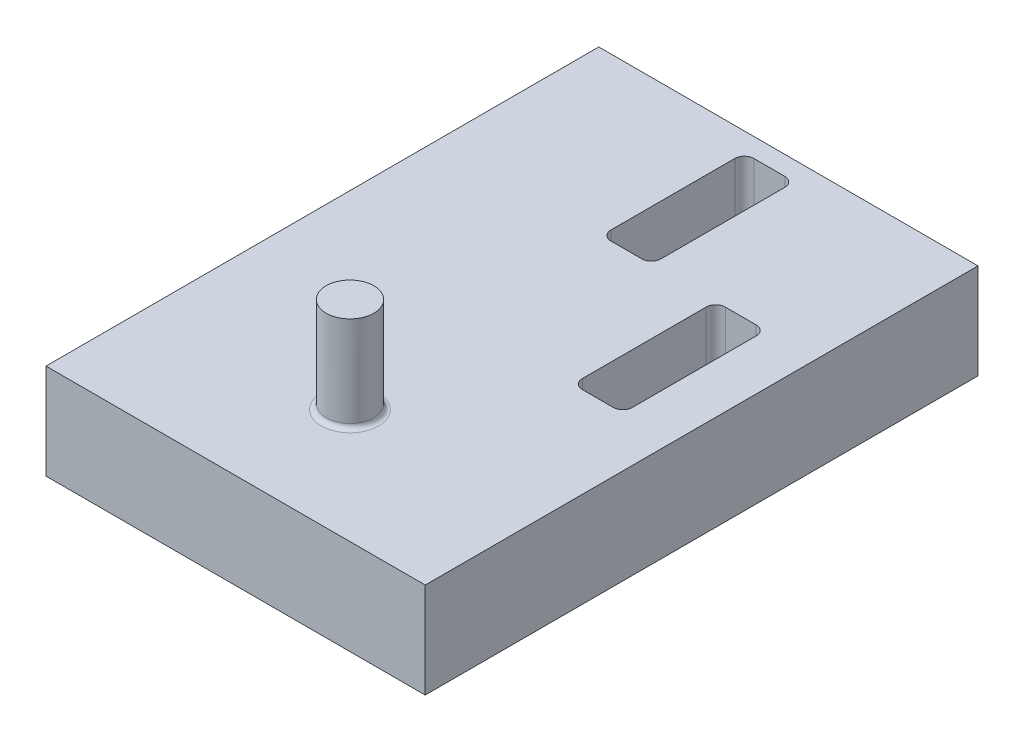
ISO-10303-21;
HEADER;
FILE_DESCRIPTION(('STEP AP214'),'2;1');
FILE_NAME('part.step','',(''),(''),'','','');
FILE_SCHEMA(('AUTOMOTIVE_DESIGN { 1 0 10303 214 1 1 1 1 }'));
ENDSEC;
DATA;
#1=APPLICATION_CONTEXT('core data for automotive mechanical design processes');
#2=APPLICATION_PROTOCOL_DEFINITION('international standard','automotive_design',2000,#1);
#3=PRODUCT_CONTEXT('',#1,'mechanical');
#4=PRODUCT('Part','Part','',(#3));
#5=PRODUCT_RELATED_PRODUCT_CATEGORY('part','',(#4));
#6=PRODUCT_DEFINITION_FORMATION('','',#4);
#7=PRODUCT_DEFINITION_CONTEXT('part definition',#1,'design');
#8=PRODUCT_DEFINITION('design','',#6,#7);
#9=PRODUCT_DEFINITION_SHAPE('','',#8);
#10=(LENGTH_UNIT() NAMED_UNIT(*) SI_UNIT(.MILLI.,.METRE.));
#11=(NAMED_UNIT(*) PLANE_ANGLE_UNIT() SI_UNIT($,.RADIAN.));
#12=(NAMED_UNIT(*) SI_UNIT($,.STERADIAN.) SOLID_ANGLE_UNIT());
#13=UNCERTAINTY_MEASURE_WITH_UNIT(LENGTH_MEASURE(1.E-05),#10,'distance_accuracy_value','');
#14=(GEOMETRIC_REPRESENTATION_CONTEXT(3) GLOBAL_UNCERTAINTY_ASSIGNED_CONTEXT((#13)) GLOBAL_UNIT_ASSIGNED_CONTEXT((#10,
#11,#12)) REPRESENTATION_CONTEXT('',''));
#15=CARTESIAN_POINT('',(0.,0.,0.));
#16=DIRECTION('',(0.,0.,1.));
#17=DIRECTION('',(1.,0.,0.));
#18=AXIS2_PLACEMENT_3D('',#15,#16,#17);
#19=CARTESIAN_POINT('',(0.,10.,0.));
#20=DIRECTION('',(0.,-1.,0.));
#21=DIRECTION('',(0.,0.,-1.));
#22=AXIS2_PLACEMENT_3D('',#19,#20,#21);
#23=PLANE('',#22);
#24=CARTESIAN_POINT('',(0.,10.,-31.5));
#25=DIRECTION('',(0.,-1.,0.));
#26=DIRECTION('',(0.,0.,-1.));
#27=AXIS2_PLACEMENT_3D('',#24,#25,#26);
#28=CIRCLE('',#27,3.);
#29=CARTESIAN_POINT('',(0.,10.,-34.5));
#30=VERTEX_POINT('',#29);
#31=EDGE_CURVE('E11',#30,#30,#28,.T.);
#32=ORIENTED_EDGE('',*,*,#31,.T.);
#33=EDGE_LOOP('',(#32));
#34=FACE_BOUND('',#33,.T.);
#35=DIRECTION('',(-1.,0.,0.));
#36=VECTOR('',#35,1.);
#37=CARTESIAN_POINT('',(11.9999999999999,10.,-60.5));
#38=LINE('',#37,#36);
#39=CARTESIAN_POINT('',(13.6249999999999,10.,-60.5));
#40=VERTEX_POINT('',#39);
#41=CARTESIAN_POINT('',(10.375,10.,-60.5));
#42=VERTEX_POINT('',#41);
#43=EDGE_CURVE('E369',#40,#42,#38,.T.);
#44=ORIENTED_EDGE('',*,*,#43,.F.);
#45=CARTESIAN_POINT('',(13.6249999999999,10.,-59.5));
#46=DIRECTION('',(0.,-1.,0.));
#47=DIRECTION('',(0.,0.,-1.));
#48=AXIS2_PLACEMENT_3D('',#45,#46,#47);
#49=CIRCLE('',#48,1.);
#50=CARTESIAN_POINT('',(14.6249999999999,10.,-59.5));
#51=VERTEX_POINT('',#50);
#52=EDGE_CURVE('E277',#40,#51,#49,.T.);
#53=ORIENTED_EDGE('',*,*,#52,.T.);
#54=DIRECTION('',(0.,0.,-1.));
#55=VECTOR('',#54,1.);
#56=CARTESIAN_POINT('',(14.6249999999999,10.,-60.5));
#57=LINE('',#56,#55);
#58=CARTESIAN_POINT('',(14.6249999999999,10.,-46.5));
#59=VERTEX_POINT('',#58);
#60=EDGE_CURVE('E367',#59,#51,#57,.T.);
#61=ORIENTED_EDGE('',*,*,#60,.F.);
#62=CARTESIAN_POINT('',(13.625,10.,-46.5));
#63=DIRECTION('',(0.,-1.,0.));
#64=DIRECTION('',(0.,0.,-1.));
#65=AXIS2_PLACEMENT_3D('',#62,#63,#64);
#66=CIRCLE('',#65,1.);
#67=CARTESIAN_POINT('',(13.625,10.,-45.5));
#68=VERTEX_POINT('',#67);
#69=EDGE_CURVE('E270',#59,#68,#66,.T.);
#70=ORIENTED_EDGE('',*,*,#69,.T.);
#71=DIRECTION('',(1.,0.,0.));
#72=VECTOR('',#71,1.);
#73=CARTESIAN_POINT('',(12.,10.,-45.5));
#74=LINE('',#73,#72);
#75=CARTESIAN_POINT('',(10.375,10.,-45.5));
#76=VERTEX_POINT('',#75);
#77=EDGE_CURVE('E385',#76,#68,#74,.T.);
#78=ORIENTED_EDGE('',*,*,#77,.F.);
#79=CARTESIAN_POINT('',(10.375,10.,-46.5));
#80=DIRECTION('',(0.,-1.,0.));
#81=DIRECTION('',(0.,0.,-1.));
#82=AXIS2_PLACEMENT_3D('',#79,#80,#81);
#83=CIRCLE('',#82,1.);
#84=CARTESIAN_POINT('',(9.37499999999995,10.,-46.5));
#85=VERTEX_POINT('',#84);
#86=EDGE_CURVE('E266',#76,#85,#83,.T.);
#87=ORIENTED_EDGE('',*,*,#86,.T.);
#88=DIRECTION('',(0.,0.,1.));
#89=VECTOR('',#88,1.);
#90=CARTESIAN_POINT('',(9.37499999999995,10.,-60.5));
#91=LINE('',#90,#89);
#92=CARTESIAN_POINT('',(9.37499999999995,10.,-59.5));
#93=VERTEX_POINT('',#92);
#94=EDGE_CURVE('E376',#93,#85,#91,.T.);
#95=ORIENTED_EDGE('',*,*,#94,.F.);
#96=CARTESIAN_POINT('',(10.375,10.,-59.5));
#97=DIRECTION('',(0.,-1.,0.));
#98=DIRECTION('',(0.,0.,-1.));
#99=AXIS2_PLACEMENT_3D('',#96,#97,#98);
#100=CIRCLE('',#99,1.);
#101=EDGE_CURVE('E57',#93,#42,#100,.T.);
#102=ORIENTED_EDGE('',*,*,#101,.T.);
#103=EDGE_LOOP('',(#44,#53,#61,#70,#78,#87,#95,#102));
#104=FACE_BOUND('',#103,.T.);
#105=DIRECTION('',(-1.,0.,0.));
#106=VECTOR('',#105,1.);
#107=CARTESIAN_POINT('',(0.,10.,-75.5));
#108=LINE('',#107,#106);
#109=CARTESIAN_POINT('',(1.62500000000019,10.,-75.5000000000001));
#110=VERTEX_POINT('',#109);
#111=CARTESIAN_POINT('',(-1.62500000000002,10.,-75.5));
#112=VERTEX_POINT('',#111);
#113=EDGE_CURVE('E197',#110,#112,#108,.T.);
#114=ORIENTED_EDGE('',*,*,#113,.F.);
#115=CARTESIAN_POINT('',(1.6250000000002,10.,-74.5000000000001));
#116=DIRECTION('',(0.,-1.,0.));
#117=DIRECTION('',(0.,0.,-1.));
#118=AXIS2_PLACEMENT_3D('',#115,#116,#117);
#119=CIRCLE('',#118,1.);
#120=CARTESIAN_POINT('',(2.62500000000014,10.,-74.5000000000001));
#121=VERTEX_POINT('',#120);
#122=EDGE_CURVE('E242',#110,#121,#119,.T.);
#123=ORIENTED_EDGE('',*,*,#122,.T.);
#124=DIRECTION('',(0.,0.,-1.));
#125=VECTOR('',#124,1.);
#126=CARTESIAN_POINT('',(2.62500000000012,10.,-60.5));
#127=LINE('',#126,#125);
#128=CARTESIAN_POINT('',(2.62500000000012,10.,-61.5));
#129=VERTEX_POINT('',#128);
#130=EDGE_CURVE('E399',#129,#121,#127,.T.);
#131=ORIENTED_EDGE('',*,*,#130,.F.);
#132=CARTESIAN_POINT('',(1.62500000000018,10.,-61.5));
#133=DIRECTION('',(0.,-1.,0.));
#134=DIRECTION('',(0.,0.,-1.));
#135=AXIS2_PLACEMENT_3D('',#132,#133,#134);
#136=CIRCLE('',#135,1.);
#137=CARTESIAN_POINT('',(1.62500000000018,10.,-60.5));
#138=VERTEX_POINT('',#137);
#139=EDGE_CURVE('E238',#129,#138,#136,.T.);
#140=ORIENTED_EDGE('',*,*,#139,.T.);
#141=DIRECTION('',(-1.,0.,0.));
#142=VECTOR('',#141,1.);
#143=CARTESIAN_POINT('',(0.,10.,-60.5));
#144=LINE('',#143,#142);
#145=CARTESIAN_POINT('',(-1.62500000000001,10.,-60.5));
#146=VERTEX_POINT('',#145);
#147=EDGE_CURVE('E414',#138,#146,#144,.T.);
#148=ORIENTED_EDGE('',*,*,#147,.T.);
#149=CARTESIAN_POINT('',(-1.62500000000001,10.,-61.5));
#150=DIRECTION('',(0.,-1.,0.));
#151=DIRECTION('',(0.,0.,-1.));
#152=AXIS2_PLACEMENT_3D('',#149,#150,#151);
#153=CIRCLE('',#152,1.);
#154=CARTESIAN_POINT('',(-2.62500000000006,10.,-61.5));
#155=VERTEX_POINT('',#154);
#156=EDGE_CURVE('E219',#146,#155,#153,.T.);
#157=ORIENTED_EDGE('',*,*,#156,.T.);
#158=DIRECTION('',(0.,0.,1.));
#159=VECTOR('',#158,1.);
#160=CARTESIAN_POINT('',(-2.62500000000006,10.,-75.5));
#161=LINE('',#160,#159);
#162=CARTESIAN_POINT('',(-2.62500000000006,10.,-74.5));
#163=VERTEX_POINT('',#162);
#164=EDGE_CURVE('E411',#163,#155,#161,.T.);
#165=ORIENTED_EDGE('',*,*,#164,.F.);
#166=CARTESIAN_POINT('',(-1.62500000000001,10.,-74.5));
#167=DIRECTION('',(0.,-1.,0.));
#168=DIRECTION('',(0.,0.,-1.));
#169=AXIS2_PLACEMENT_3D('',#166,#167,#168);
#170=CIRCLE('',#169,1.);
#171=EDGE_CURVE('E223',#163,#112,#170,.T.);
#172=ORIENTED_EDGE('',*,*,#171,.T.);
#173=EDGE_LOOP('',(#114,#123,#131,#140,#148,#157,#165,#172));
#174=FACE_BOUND('',#173,.T.);
#175=DIRECTION('',(0.,0.,1.));
#176=VECTOR('',#175,1.);
#177=CARTESIAN_POINT('',(-19.8937990848772,10.,-77.5));
#178=LINE('',#177,#176);
#179=CARTESIAN_POINT('',(-19.8937990848772,10.,-77.5));
#180=VERTEX_POINT('',#179);
#181=CARTESIAN_POINT('',(-19.8937990848772,10.,-19.5000000000026));
#182=VERTEX_POINT('',#181);
#183=EDGE_CURVE('E205',#180,#182,#178,.T.);
#184=ORIENTED_EDGE('',*,*,#183,.T.);
#185=DIRECTION('',(-1.,0.,0.));
#186=VECTOR('',#185,1.);
#187=CARTESIAN_POINT('',(-19.8937990848772,10.,-19.5000000000026));
#188=LINE('',#187,#186);
#189=CARTESIAN_POINT('',(19.8937990848773,10.,-19.5000000000026));
#190=VERTEX_POINT('',#189);
#191=EDGE_CURVE('E174',#190,#182,#188,.T.);
#192=ORIENTED_EDGE('',*,*,#191,.F.);
#193=DIRECTION('',(0.,0.,1.));
#194=VECTOR('',#193,1.);
#195=CARTESIAN_POINT('',(19.8937990848774,10.,-77.5));
#196=LINE('',#195,#194);
#197=CARTESIAN_POINT('',(19.8937990848774,10.,-77.5));
#198=VERTEX_POINT('',#197);
#199=EDGE_CURVE('E396',#198,#190,#196,.T.);
#200=ORIENTED_EDGE('',*,*,#199,.F.);
#201=DIRECTION('',(1.,0.,0.));
#202=VECTOR('',#201,1.);
#203=CARTESIAN_POINT('',(-19.8937990848772,10.,-77.5));
#204=LINE('',#203,#202);
#205=EDGE_CURVE('E194',#180,#198,#204,.T.);
#206=ORIENTED_EDGE('',*,*,#205,.F.);
#207=EDGE_LOOP('',(#184,#192,#200,#206));
#208=FACE_BOUND('',#207,.T.);
#209=ADVANCED_FACE('F34',(#34,#104,#174,#208),#23,.F.);
#210=CARTESIAN_POINT('',(0.,0.,0.));
#211=DIRECTION('',(0.,-1.,0.));
#212=DIRECTION('',(0.,0.,-1.));
#213=AXIS2_PLACEMENT_3D('',#210,#211,#212);
#214=PLANE('',#213);
#215=DIRECTION('',(-1.,0.,0.));
#216=VECTOR('',#215,1.);
#217=CARTESIAN_POINT('',(-19.8937990848772,0.,-19.5000000000026));
#218=LINE('',#217,#216);
#219=CARTESIAN_POINT('',(19.8937990848773,0.,-19.5000000000026));
#220=VERTEX_POINT('',#219);
#221=CARTESIAN_POINT('',(-19.8937990848772,0.,-19.5000000000026));
#222=VERTEX_POINT('',#221);
#223=EDGE_CURVE('E49',#220,#222,#218,.T.);
#224=ORIENTED_EDGE('',*,*,#223,.T.);
#225=DIRECTION('',(0.,0.,1.));
#226=VECTOR('',#225,1.);
#227=CARTESIAN_POINT('',(-19.8937990848772,0.,-77.5));
#228=LINE('',#227,#226);
#229=CARTESIAN_POINT('',(-19.8937990848772,0.,-77.5));
#230=VERTEX_POINT('',#229);
#231=EDGE_CURVE('E187',#230,#222,#228,.T.);
#232=ORIENTED_EDGE('',*,*,#231,.F.);
#233=DIRECTION('',(1.,0.,0.));
#234=VECTOR('',#233,1.);
#235=CARTESIAN_POINT('',(-19.8937990848772,0.,-77.5));
#236=LINE('',#235,#234);
#237=CARTESIAN_POINT('',(19.8937990848774,0.,-77.5));
#238=VERTEX_POINT('',#237);
#239=EDGE_CURVE('E408',#230,#238,#236,.T.);
#240=ORIENTED_EDGE('',*,*,#239,.T.);
#241=DIRECTION('',(0.,0.,1.));
#242=VECTOR('',#241,1.);
#243=CARTESIAN_POINT('',(19.8937990848774,0.,-77.5));
#244=LINE('',#243,#242);
#245=EDGE_CURVE('E190',#238,#220,#244,.T.);
#246=ORIENTED_EDGE('',*,*,#245,.T.);
#247=EDGE_LOOP('',(#224,#232,#240,#246));
#248=FACE_BOUND('',#247,.T.);
#249=DIRECTION('',(0.,0.,1.));
#250=VECTOR('',#249,1.);
#251=CARTESIAN_POINT('',(2.6250000000002,0.,-75.5));
#252=LINE('',#251,#250);
#253=CARTESIAN_POINT('',(2.6250000000002,0.,-74.5000000000001));
#254=VERTEX_POINT('',#253);
#255=CARTESIAN_POINT('',(2.62500000000018,0.,-61.5));
#256=VERTEX_POINT('',#255);
#257=EDGE_CURVE('E400',#254,#256,#252,.T.);
#258=ORIENTED_EDGE('',*,*,#257,.F.);
#259=CARTESIAN_POINT('',(1.6250000000002,0.,-74.5000000000001));
#260=DIRECTION('',(0.,-1.,0.));
#261=DIRECTION('',(0.,0.,-1.));
#262=AXIS2_PLACEMENT_3D('',#259,#260,#261);
#263=CIRCLE('',#262,1.);
#264=CARTESIAN_POINT('',(1.62500000000019,0.,-75.5000000000001));
#265=VERTEX_POINT('',#264);
#266=EDGE_CURVE('E240',#254,#265,#263,.F.);
#267=ORIENTED_EDGE('',*,*,#266,.T.);
#268=DIRECTION('',(-1.,0.,0.));
#269=VECTOR('',#268,1.);
#270=CARTESIAN_POINT('',(0.,0.,-75.5));
#271=LINE('',#270,#269);
#272=CARTESIAN_POINT('',(-1.62500000000002,0.,-75.5));
#273=VERTEX_POINT('',#272);
#274=EDGE_CURVE('E418',#265,#273,#271,.T.);
#275=ORIENTED_EDGE('',*,*,#274,.T.);
#276=CARTESIAN_POINT('',(-1.62500000000001,0.,-74.5));
#277=DIRECTION('',(0.,-1.,0.));
#278=DIRECTION('',(0.,0.,-1.));
#279=AXIS2_PLACEMENT_3D('',#276,#277,#278);
#280=CIRCLE('',#279,1.);
#281=CARTESIAN_POINT('',(-2.62500000000001,0.,-74.5));
#282=VERTEX_POINT('',#281);
#283=EDGE_CURVE('E221',#273,#282,#280,.F.);
#284=ORIENTED_EDGE('',*,*,#283,.T.);
#285=DIRECTION('',(0.,0.,-1.));
#286=VECTOR('',#285,1.);
#287=CARTESIAN_POINT('',(-2.62500000000001,0.,-60.5));
#288=LINE('',#287,#286);
#289=CARTESIAN_POINT('',(-2.62500000000001,0.,-61.5));
#290=VERTEX_POINT('',#289);
#291=EDGE_CURVE('E199',#290,#282,#288,.T.);
#292=ORIENTED_EDGE('',*,*,#291,.F.);
#293=CARTESIAN_POINT('',(-1.62500000000001,0.,-61.5));
#294=DIRECTION('',(0.,-1.,0.));
#295=DIRECTION('',(0.,0.,-1.));
#296=AXIS2_PLACEMENT_3D('',#293,#294,#295);
#297=CIRCLE('',#296,1.);
#298=CARTESIAN_POINT('',(-1.62500000000001,0.,-60.5));
#299=VERTEX_POINT('',#298);
#300=EDGE_CURVE('E216',#290,#299,#297,.F.);
#301=ORIENTED_EDGE('',*,*,#300,.T.);
#302=DIRECTION('',(-1.,0.,0.));
#303=VECTOR('',#302,1.);
#304=CARTESIAN_POINT('',(0.,0.,-60.5));
#305=LINE('',#304,#303);
#306=CARTESIAN_POINT('',(1.62500000000018,0.,-60.5));
#307=VERTEX_POINT('',#306);
#308=EDGE_CURVE('E195',#307,#299,#305,.T.);
#309=ORIENTED_EDGE('',*,*,#308,.F.);
#310=CARTESIAN_POINT('',(1.62500000000018,0.,-61.5));
#311=DIRECTION('',(0.,-1.,0.));
#312=DIRECTION('',(0.,0.,-1.));
#313=AXIS2_PLACEMENT_3D('',#310,#311,#312);
#314=CIRCLE('',#313,1.);
#315=EDGE_CURVE('E236',#307,#256,#314,.F.);
#316=ORIENTED_EDGE('',*,*,#315,.T.);
#317=EDGE_LOOP('',(#258,#267,#275,#284,#292,#301,#309,#316));
#318=FACE_BOUND('',#317,.T.);
#319=DIRECTION('',(1.,0.,0.));
#320=VECTOR('',#319,1.);
#321=CARTESIAN_POINT('',(12.,0.,-45.5));
#322=LINE('',#321,#320);
#323=CARTESIAN_POINT('',(10.375,0.,-45.5));
#324=VERTEX_POINT('',#323);
#325=CARTESIAN_POINT('',(13.625,0.,-45.5));
#326=VERTEX_POINT('',#325);
#327=EDGE_CURVE('E378',#324,#326,#322,.T.);
#328=ORIENTED_EDGE('',*,*,#327,.T.);
#329=CARTESIAN_POINT('',(13.625,0.,-46.5));
#330=DIRECTION('',(0.,-1.,0.));
#331=DIRECTION('',(0.,0.,-1.));
#332=AXIS2_PLACEMENT_3D('',#329,#330,#331);
#333=CIRCLE('',#332,1.);
#334=CARTESIAN_POINT('',(14.625,0.,-46.5));
#335=VERTEX_POINT('',#334);
#336=EDGE_CURVE('E268',#326,#335,#333,.F.);
#337=ORIENTED_EDGE('',*,*,#336,.T.);
#338=DIRECTION('',(0.,0.,-1.));
#339=VECTOR('',#338,1.);
#340=CARTESIAN_POINT('',(14.6249999999999,0.,-58.));
#341=LINE('',#340,#339);
#342=CARTESIAN_POINT('',(14.6249999999999,0.,-59.5));
#343=VERTEX_POINT('',#342);
#344=EDGE_CURVE('E374',#335,#343,#341,.T.);
#345=ORIENTED_EDGE('',*,*,#344,.T.);
#346=CARTESIAN_POINT('',(13.6249999999999,0.,-59.5));
#347=DIRECTION('',(0.,-1.,0.));
#348=DIRECTION('',(0.,0.,-1.));
#349=AXIS2_PLACEMENT_3D('',#346,#347,#348);
#350=CIRCLE('',#349,1.);
#351=CARTESIAN_POINT('',(13.6249999999999,0.,-60.5));
#352=VERTEX_POINT('',#351);
#353=EDGE_CURVE('E275',#343,#352,#350,.F.);
#354=ORIENTED_EDGE('',*,*,#353,.T.);
#355=DIRECTION('',(-1.,0.,0.));
#356=VECTOR('',#355,1.);
#357=CARTESIAN_POINT('',(11.9999999999999,0.,-60.5));
#358=LINE('',#357,#356);
#359=CARTESIAN_POINT('',(10.375,0.,-60.5));
#360=VERTEX_POINT('',#359);
#361=EDGE_CURVE('E388',#352,#360,#358,.T.);
#362=ORIENTED_EDGE('',*,*,#361,.T.);
#363=CARTESIAN_POINT('',(10.375,0.,-59.5));
#364=DIRECTION('',(0.,-1.,0.));
#365=DIRECTION('',(0.,0.,-1.));
#366=AXIS2_PLACEMENT_3D('',#363,#364,#365);
#367=CIRCLE('',#366,1.);
#368=CARTESIAN_POINT('',(9.37500000000001,0.,-59.5));
#369=VERTEX_POINT('',#368);
#370=EDGE_CURVE('E272',#360,#369,#367,.F.);
#371=ORIENTED_EDGE('',*,*,#370,.T.);
#372=DIRECTION('',(0.,0.,1.));
#373=VECTOR('',#372,1.);
#374=CARTESIAN_POINT('',(9.37500000000001,0.,-45.5));
#375=LINE('',#374,#373);
#376=CARTESIAN_POINT('',(9.37500000000001,0.,-46.5));
#377=VERTEX_POINT('',#376);
#378=EDGE_CURVE('E391',#369,#377,#375,.T.);
#379=ORIENTED_EDGE('',*,*,#378,.T.);
#380=CARTESIAN_POINT('',(10.375,0.,-46.5));
#381=DIRECTION('',(0.,-1.,0.));
#382=DIRECTION('',(0.,0.,-1.));
#383=AXIS2_PLACEMENT_3D('',#380,#381,#382);
#384=CIRCLE('',#383,1.);
#385=EDGE_CURVE('E264',#377,#324,#384,.F.);
#386=ORIENTED_EDGE('',*,*,#385,.T.);
#387=EDGE_LOOP('',(#328,#337,#345,#354,#362,#371,#379,#386));
#388=FACE_BOUND('',#387,.T.);
#389=ADVANCED_FACE('F185',(#248,#318,#388),#214,.T.);
#390=CARTESIAN_POINT('',(-19.8937990848772,10.,-77.5));
#391=DIRECTION('',(0.,0.,-1.));
#392=DIRECTION('',(-1.,0.,0.));
#393=AXIS2_PLACEMENT_3D('',#390,#391,#392);
#394=PLANE('',#393);
#395=ORIENTED_EDGE('',*,*,#239,.F.);
#396=DIRECTION('',(0.,-1.,0.));
#397=VECTOR('',#396,1.);
#398=CARTESIAN_POINT('',(-19.8937990848772,10.,-77.5));
#399=LINE('',#398,#397);
#400=EDGE_CURVE('E193',#180,#230,#399,.T.);
#401=ORIENTED_EDGE('',*,*,#400,.F.);
#402=ORIENTED_EDGE('',*,*,#205,.T.);
#403=DIRECTION('',(0.,-1.,0.));
#404=VECTOR('',#403,1.);
#405=CARTESIAN_POINT('',(19.8937990848774,10.,-77.5));
#406=LINE('',#405,#404);
#407=EDGE_CURVE('E403',#198,#238,#406,.T.);
#408=ORIENTED_EDGE('',*,*,#407,.T.);
#409=EDGE_LOOP('',(#395,#401,#402,#408));
#410=FACE_BOUND('',#409,.T.);
#411=ADVANCED_FACE('F301',(#410),#394,.T.);
#412=CARTESIAN_POINT('',(-19.8937990848772,10.,-77.5));
#413=DIRECTION('',(1.,0.,0.));
#414=DIRECTION('',(0.,0.,-1.));
#415=AXIS2_PLACEMENT_3D('',#412,#413,#414);
#416=PLANE('',#415);
#417=ORIENTED_EDGE('',*,*,#231,.T.);
#418=DIRECTION('',(0.,1.,0.));
#419=VECTOR('',#418,1.);
#420=CARTESIAN_POINT('',(-19.8937990848772,0.,-19.5000000000026));
#421=LINE('',#420,#419);
#422=EDGE_CURVE('E171',#222,#182,#421,.T.);
#423=ORIENTED_EDGE('',*,*,#422,.T.);
#424=ORIENTED_EDGE('',*,*,#183,.F.);
#425=ORIENTED_EDGE('',*,*,#400,.T.);
#426=EDGE_LOOP('',(#417,#423,#424,#425));
#427=FACE_BOUND('',#426,.T.);
#428=ADVANCED_FACE('F192',(#427),#416,.F.);
#429=CARTESIAN_POINT('',(0.,10.,-60.5));
#430=DIRECTION('',(0.,0.,1.));
#431=DIRECTION('',(1.,0.,0.));
#432=AXIS2_PLACEMENT_3D('',#429,#430,#431);
#433=PLANE('',#432);
#434=ORIENTED_EDGE('',*,*,#147,.F.);
#435=DIRECTION('',(0.,-1.,0.));
#436=VECTOR('',#435,1.);
#437=CARTESIAN_POINT('',(1.62500000000018,0.,-60.5));
#438=LINE('',#437,#436);
#439=EDGE_CURVE('E226',#138,#307,#438,.T.);
#440=ORIENTED_EDGE('',*,*,#439,.T.);
#441=ORIENTED_EDGE('',*,*,#308,.T.);
#442=DIRECTION('',(0.,-1.,0.));
#443=VECTOR('',#442,1.);
#444=CARTESIAN_POINT('',(-1.62500000000001,10.,-60.5));
#445=LINE('',#444,#443);
#446=EDGE_CURVE('E210',#299,#146,#445,.F.);
#447=ORIENTED_EDGE('',*,*,#446,.T.);
#448=EDGE_LOOP('',(#434,#440,#441,#447));
#449=FACE_BOUND('',#448,.T.);
#450=ADVANCED_FACE('F309',(#449),#433,.F.);
#451=CARTESIAN_POINT('',(-2.62500000000001,10.,-60.5));
#452=DIRECTION('',(-1.,0.,0.));
#453=DIRECTION('',(0.,0.,1.));
#454=AXIS2_PLACEMENT_3D('',#451,#452,#453);
#455=PLANE('',#454);
#456=ORIENTED_EDGE('',*,*,#164,.T.);
#457=DIRECTION('',(0.,-1.,0.));
#458=VECTOR('',#457,1.);
#459=CARTESIAN_POINT('',(-2.62500000000001,0.,-61.5));
#460=LINE('',#459,#458);
#461=EDGE_CURVE('E207',#155,#290,#460,.T.);
#462=ORIENTED_EDGE('',*,*,#461,.T.);
#463=ORIENTED_EDGE('',*,*,#291,.T.);
#464=DIRECTION('',(0.,-1.,0.));
#465=VECTOR('',#464,1.);
#466=CARTESIAN_POINT('',(-2.62500000000001,10.,-74.5));
#467=LINE('',#466,#465);
#468=EDGE_CURVE('E204',#282,#163,#467,.F.);
#469=ORIENTED_EDGE('',*,*,#468,.T.);
#470=EDGE_LOOP('',(#456,#462,#463,#469));
#471=FACE_BOUND('',#470,.T.);
#472=ADVANCED_FACE('F312',(#471),#455,.F.);
#473=CARTESIAN_POINT('',(0.,10.,-75.5));
#474=DIRECTION('',(0.,0.,1.));
#475=DIRECTION('',(1.,0.,0.));
#476=AXIS2_PLACEMENT_3D('',#473,#474,#475);
#477=PLANE('',#476);
#478=ORIENTED_EDGE('',*,*,#274,.F.);
#479=DIRECTION('',(0.,-1.,0.));
#480=VECTOR('',#479,1.);
#481=CARTESIAN_POINT('',(1.62500000000019,10.,-75.5000000000001));
#482=LINE('',#481,#480);
#483=EDGE_CURVE('E234',#265,#110,#482,.F.);
#484=ORIENTED_EDGE('',*,*,#483,.T.);
#485=ORIENTED_EDGE('',*,*,#113,.T.);
#486=DIRECTION('',(0.,-1.,0.));
#487=VECTOR('',#486,1.);
#488=CARTESIAN_POINT('',(-1.62500000000002,10.,-75.5));
#489=LINE('',#488,#487);
#490=EDGE_CURVE('E213',#112,#273,#489,.T.);
#491=ORIENTED_EDGE('',*,*,#490,.T.);
#492=EDGE_LOOP('',(#478,#484,#485,#491));
#493=FACE_BOUND('',#492,.T.);
#494=ADVANCED_FACE('F316',(#493),#477,.T.);
#495=CARTESIAN_POINT('',(-1.62500000000001,10.,-61.5));
#496=DIRECTION('',(0.,1.,0.));
#497=DIRECTION('',(0.,0.,1.));
#498=AXIS2_PLACEMENT_3D('',#495,#496,#497);
#499=CYLINDRICAL_SURFACE('',#498,1.);
#500=ORIENTED_EDGE('',*,*,#156,.F.);
#501=ORIENTED_EDGE('',*,*,#446,.F.);
#502=ORIENTED_EDGE('',*,*,#300,.F.);
#503=ORIENTED_EDGE('',*,*,#461,.F.);
#504=EDGE_LOOP('',(#500,#501,#502,#503));
#505=FACE_BOUND('',#504,.T.);
#506=ADVANCED_FACE('F320',(#505),#499,.F.);
#507=CARTESIAN_POINT('',(-1.62500000000001,10.,-74.5));
#508=DIRECTION('',(0.,-1.,0.));
#509=DIRECTION('',(0.,0.,-1.));
#510=AXIS2_PLACEMENT_3D('',#507,#508,#509);
#511=CYLINDRICAL_SURFACE('',#510,1.);
#512=ORIENTED_EDGE('',*,*,#171,.F.);
#513=ORIENTED_EDGE('',*,*,#468,.F.);
#514=ORIENTED_EDGE('',*,*,#283,.F.);
#515=ORIENTED_EDGE('',*,*,#490,.F.);
#516=EDGE_LOOP('',(#512,#513,#514,#515));
#517=FACE_BOUND('',#516,.T.);
#518=ADVANCED_FACE('F327',(#517),#511,.F.);
#519=CARTESIAN_POINT('',(2.6250000000002,10.,-75.5));
#520=DIRECTION('',(1.,0.,0.));
#521=DIRECTION('',(0.,0.,-1.));
#522=AXIS2_PLACEMENT_3D('',#519,#520,#521);
#523=PLANE('',#522);
#524=ORIENTED_EDGE('',*,*,#257,.T.);
#525=DIRECTION('',(0.,-1.,0.));
#526=VECTOR('',#525,1.);
#527=CARTESIAN_POINT('',(2.62500000000018,10.,-61.5));
#528=LINE('',#527,#526);
#529=EDGE_CURVE('E232',#256,#129,#528,.F.);
#530=ORIENTED_EDGE('',*,*,#529,.T.);
#531=ORIENTED_EDGE('',*,*,#130,.T.);
#532=DIRECTION('',(0.,-1.,0.));
#533=VECTOR('',#532,1.);
#534=CARTESIAN_POINT('',(2.6250000000002,10.,-74.5000000000001));
#535=LINE('',#534,#533);
#536=EDGE_CURVE('E229',#121,#254,#535,.T.);
#537=ORIENTED_EDGE('',*,*,#536,.T.);
#538=EDGE_LOOP('',(#524,#530,#531,#537));
#539=FACE_BOUND('',#538,.T.);
#540=ADVANCED_FACE('F331',(#539),#523,.F.);
#541=CARTESIAN_POINT('',(19.8937990848774,10.,-77.5));
#542=DIRECTION('',(1.,0.,0.));
#543=DIRECTION('',(0.,0.,-1.));
#544=AXIS2_PLACEMENT_3D('',#541,#542,#543);
#545=PLANE('',#544);
#546=DIRECTION('',(0.,1.,0.));
#547=VECTOR('',#546,1.);
#548=CARTESIAN_POINT('',(19.8937990848773,0.,-19.5000000000026));
#549=LINE('',#548,#547);
#550=EDGE_CURVE('E180',#220,#190,#549,.T.);
#551=ORIENTED_EDGE('',*,*,#550,.F.);
#552=ORIENTED_EDGE('',*,*,#245,.F.);
#553=ORIENTED_EDGE('',*,*,#407,.F.);
#554=ORIENTED_EDGE('',*,*,#199,.T.);
#555=EDGE_LOOP('',(#551,#552,#553,#554));
#556=FACE_BOUND('',#555,.T.);
#557=ADVANCED_FACE('F304',(#556),#545,.T.);
#558=CARTESIAN_POINT('',(1.62500000000018,10.,-61.5));
#559=DIRECTION('',(0.,1.,0.));
#560=DIRECTION('',(0.,0.,1.));
#561=AXIS2_PLACEMENT_3D('',#558,#559,#560);
#562=CYLINDRICAL_SURFACE('',#561,1.);
#563=ORIENTED_EDGE('',*,*,#139,.F.);
#564=ORIENTED_EDGE('',*,*,#529,.F.);
#565=ORIENTED_EDGE('',*,*,#315,.F.);
#566=ORIENTED_EDGE('',*,*,#439,.F.);
#567=EDGE_LOOP('',(#563,#564,#565,#566));
#568=FACE_BOUND('',#567,.T.);
#569=ADVANCED_FACE('F333',(#568),#562,.F.);
#570=CARTESIAN_POINT('',(1.6250000000002,10.,-74.5000000000001));
#571=DIRECTION('',(0.,-1.,0.));
#572=DIRECTION('',(0.,0.,-1.));
#573=AXIS2_PLACEMENT_3D('',#570,#571,#572);
#574=CYLINDRICAL_SURFACE('',#573,1.);
#575=ORIENTED_EDGE('',*,*,#122,.F.);
#576=ORIENTED_EDGE('',*,*,#483,.F.);
#577=ORIENTED_EDGE('',*,*,#266,.F.);
#578=ORIENTED_EDGE('',*,*,#536,.F.);
#579=EDGE_LOOP('',(#575,#576,#577,#578));
#580=FACE_BOUND('',#579,.T.);
#581=ADVANCED_FACE('F336',(#580),#574,.F.);
#582=CARTESIAN_POINT('',(11.9999999999999,10.,-60.5));
#583=DIRECTION('',(0.,0.,1.));
#584=DIRECTION('',(1.,0.,0.));
#585=AXIS2_PLACEMENT_3D('',#582,#583,#584);
#586=PLANE('',#585);
#587=ORIENTED_EDGE('',*,*,#43,.T.);
#588=DIRECTION('',(0.,-1.,0.));
#589=VECTOR('',#588,1.);
#590=CARTESIAN_POINT('',(10.375,0.,-60.5));
#591=LINE('',#590,#589);
#592=EDGE_CURVE('E261',#42,#360,#591,.T.);
#593=ORIENTED_EDGE('',*,*,#592,.T.);
#594=ORIENTED_EDGE('',*,*,#361,.F.);
#595=DIRECTION('',(0.,-1.,0.));
#596=VECTOR('',#595,1.);
#597=CARTESIAN_POINT('',(13.6249999999999,10.,-60.5));
#598=LINE('',#597,#596);
#599=EDGE_CURVE('E259',#352,#40,#598,.F.);
#600=ORIENTED_EDGE('',*,*,#599,.T.);
#601=EDGE_LOOP('',(#587,#593,#594,#600));
#602=FACE_BOUND('',#601,.T.);
#603=ADVANCED_FACE('F340',(#602),#586,.T.);
#604=CARTESIAN_POINT('',(9.37500000000001,10.,-45.5));
#605=DIRECTION('',(1.,0.,0.));
#606=DIRECTION('',(0.,0.,-1.));
#607=AXIS2_PLACEMENT_3D('',#604,#605,#606);
#608=PLANE('',#607);
#609=ORIENTED_EDGE('',*,*,#94,.T.);
#610=DIRECTION('',(0.,-1.,0.));
#611=VECTOR('',#610,1.);
#612=CARTESIAN_POINT('',(9.37500000000001,0.,-46.5));
#613=LINE('',#612,#611);
#614=EDGE_CURVE('E246',#85,#377,#613,.T.);
#615=ORIENTED_EDGE('',*,*,#614,.T.);
#616=ORIENTED_EDGE('',*,*,#378,.F.);
#617=DIRECTION('',(0.,-1.,0.));
#618=VECTOR('',#617,1.);
#619=CARTESIAN_POINT('',(9.37500000000001,10.,-59.5));
#620=LINE('',#619,#618);
#621=EDGE_CURVE('E244',#369,#93,#620,.F.);
#622=ORIENTED_EDGE('',*,*,#621,.T.);
#623=EDGE_LOOP('',(#609,#615,#616,#622));
#624=FACE_BOUND('',#623,.T.);
#625=ADVANCED_FACE('F453',(#624),#608,.T.);
#626=CARTESIAN_POINT('',(12.,10.,-45.5));
#627=DIRECTION('',(0.,0.,-1.));
#628=DIRECTION('',(-1.,0.,0.));
#629=AXIS2_PLACEMENT_3D('',#626,#627,#628);
#630=PLANE('',#629);
#631=ORIENTED_EDGE('',*,*,#327,.F.);
#632=DIRECTION('',(0.,-1.,0.));
#633=VECTOR('',#632,1.);
#634=CARTESIAN_POINT('',(10.375,10.,-45.5));
#635=LINE('',#634,#633);
#636=EDGE_CURVE('E252',#324,#76,#635,.F.);
#637=ORIENTED_EDGE('',*,*,#636,.T.);
#638=ORIENTED_EDGE('',*,*,#77,.T.);
#639=DIRECTION('',(0.,-1.,0.));
#640=VECTOR('',#639,1.);
#641=CARTESIAN_POINT('',(13.625,0.,-45.5));
#642=LINE('',#641,#640);
#643=EDGE_CURVE('E249',#68,#326,#642,.T.);
#644=ORIENTED_EDGE('',*,*,#643,.T.);
#645=EDGE_LOOP('',(#631,#637,#638,#644));
#646=FACE_BOUND('',#645,.T.);
#647=ADVANCED_FACE('F457',(#646),#630,.T.);
#648=CARTESIAN_POINT('',(14.6249999999999,10.,-58.));
#649=DIRECTION('',(-1.,0.,0.));
#650=DIRECTION('',(0.,0.,1.));
#651=AXIS2_PLACEMENT_3D('',#648,#649,#650);
#652=PLANE('',#651);
#653=ORIENTED_EDGE('',*,*,#344,.F.);
#654=DIRECTION('',(0.,-1.,0.));
#655=VECTOR('',#654,1.);
#656=CARTESIAN_POINT('',(14.625,10.,-46.5));
#657=LINE('',#656,#655);
#658=EDGE_CURVE('E257',#335,#59,#657,.F.);
#659=ORIENTED_EDGE('',*,*,#658,.T.);
#660=ORIENTED_EDGE('',*,*,#60,.T.);
#661=DIRECTION('',(0.,-1.,0.));
#662=VECTOR('',#661,1.);
#663=CARTESIAN_POINT('',(14.6249999999999,0.,-59.5));
#664=LINE('',#663,#662);
#665=EDGE_CURVE('E254',#51,#343,#664,.T.);
#666=ORIENTED_EDGE('',*,*,#665,.T.);
#667=EDGE_LOOP('',(#653,#659,#660,#666));
#668=FACE_BOUND('',#667,.T.);
#669=ADVANCED_FACE('F346',(#668),#652,.T.);
#670=CARTESIAN_POINT('',(10.375,10.,-46.5));
#671=DIRECTION('',(0.,1.,0.));
#672=DIRECTION('',(0.,0.,1.));
#673=AXIS2_PLACEMENT_3D('',#670,#671,#672);
#674=CYLINDRICAL_SURFACE('',#673,1.);
#675=ORIENTED_EDGE('',*,*,#86,.F.);
#676=ORIENTED_EDGE('',*,*,#636,.F.);
#677=ORIENTED_EDGE('',*,*,#385,.F.);
#678=ORIENTED_EDGE('',*,*,#614,.F.);
#679=EDGE_LOOP('',(#675,#676,#677,#678));
#680=FACE_BOUND('',#679,.T.);
#681=ADVANCED_FACE('F342',(#680),#674,.F.);
#682=CARTESIAN_POINT('',(13.625,10.,-46.5));
#683=DIRECTION('',(0.,1.,0.));
#684=DIRECTION('',(0.,0.,1.));
#685=AXIS2_PLACEMENT_3D('',#682,#683,#684);
#686=CYLINDRICAL_SURFACE('',#685,1.);
#687=ORIENTED_EDGE('',*,*,#69,.F.);
#688=ORIENTED_EDGE('',*,*,#658,.F.);
#689=ORIENTED_EDGE('',*,*,#336,.F.);
#690=ORIENTED_EDGE('',*,*,#643,.F.);
#691=EDGE_LOOP('',(#687,#688,#689,#690));
#692=FACE_BOUND('',#691,.T.);
#693=ADVANCED_FACE('F345',(#692),#686,.F.);
#694=CARTESIAN_POINT('',(10.375,10.,-59.5));
#695=DIRECTION('',(0.,1.,0.));
#696=DIRECTION('',(0.,0.,1.));
#697=AXIS2_PLACEMENT_3D('',#694,#695,#696);
#698=CYLINDRICAL_SURFACE('',#697,1.);
#699=ORIENTED_EDGE('',*,*,#101,.F.);
#700=ORIENTED_EDGE('',*,*,#621,.F.);
#701=ORIENTED_EDGE('',*,*,#370,.F.);
#702=ORIENTED_EDGE('',*,*,#592,.F.);
#703=EDGE_LOOP('',(#699,#700,#701,#702));
#704=FACE_BOUND('',#703,.T.);
#705=ADVANCED_FACE('F350',(#704),#698,.F.);
#706=CARTESIAN_POINT('',(13.6249999999999,10.,-59.5));
#707=DIRECTION('',(0.,1.,0.));
#708=DIRECTION('',(0.,0.,1.));
#709=AXIS2_PLACEMENT_3D('',#706,#707,#708);
#710=CYLINDRICAL_SURFACE('',#709,1.);
#711=ORIENTED_EDGE('',*,*,#52,.F.);
#712=ORIENTED_EDGE('',*,*,#599,.F.);
#713=ORIENTED_EDGE('',*,*,#353,.F.);
#714=ORIENTED_EDGE('',*,*,#665,.F.);
#715=EDGE_LOOP('',(#711,#712,#713,#714));
#716=FACE_BOUND('',#715,.T.);
#717=ADVANCED_FACE('F353',(#716),#710,.F.);
#718=CARTESIAN_POINT('',(0.,20.,-31.5));
#719=DIRECTION('',(0.,-1.,0.));
#720=DIRECTION('',(0.,0.,-1.));
#721=AXIS2_PLACEMENT_3D('',#718,#719,#720);
#722=CYLINDRICAL_SURFACE('',#721,2.5);
#723=CARTESIAN_POINT('',(0.,10.5,-31.5));
#724=DIRECTION('',(0.,-1.,0.));
#725=DIRECTION('',(0.,0.,-1.));
#726=AXIS2_PLACEMENT_3D('',#723,#724,#725);
#727=CIRCLE('',#726,2.5);
#728=CARTESIAN_POINT('',(0.,10.5,-34.));
#729=VERTEX_POINT('',#728);
#730=EDGE_CURVE('E42',#729,#729,#727,.F.);
#731=ORIENTED_EDGE('',*,*,#730,.T.);
#732=EDGE_LOOP('',(#731));
#733=FACE_BOUND('',#732,.T.);
#734=CARTESIAN_POINT('',(0.,20.,-31.5));
#735=DIRECTION('',(0.,1.,0.));
#736=DIRECTION('',(0.,0.,1.));
#737=AXIS2_PLACEMENT_3D('',#734,#735,#736);
#738=CIRCLE('',#737,2.5);
#739=CARTESIAN_POINT('',(0.,20.,-29.));
#740=VERTEX_POINT('',#739);
#741=EDGE_CURVE('E179',#740,#740,#738,.T.);
#742=ORIENTED_EDGE('',*,*,#741,.F.);
#743=EDGE_LOOP('',(#742));
#744=FACE_BOUND('',#743,.T.);
#745=ADVANCED_FACE('F281',(#733,#744),#722,.T.);
#746=CARTESIAN_POINT('',(0.,20.,-31.5));
#747=DIRECTION('',(0.,1.,0.));
#748=DIRECTION('',(0.,0.,1.));
#749=AXIS2_PLACEMENT_3D('',#746,#747,#748);
#750=PLANE('',#749);
#751=ORIENTED_EDGE('',*,*,#741,.T.);
#752=EDGE_LOOP('',(#751));
#753=FACE_BOUND('',#752,.T.);
#754=ADVANCED_FACE('F285',(#753),#750,.T.);
#755=CARTESIAN_POINT('',(0.,10.5,-31.5));
#756=DIRECTION('',(0.,-1.,0.));
#757=DIRECTION('',(0.,0.,-1.));
#758=AXIS2_PLACEMENT_3D('',#755,#756,#757);
#759=TOROIDAL_SURFACE('',#758,3.,0.5);
#760=ORIENTED_EDGE('',*,*,#31,.F.);
#761=EDGE_LOOP('',(#760));
#762=FACE_BOUND('',#761,.T.);
#763=ORIENTED_EDGE('',*,*,#730,.F.);
#764=EDGE_LOOP('',(#763));
#765=FACE_BOUND('',#764,.T.);
#766=ADVANCED_FACE('F36',(#762,#765),#759,.F.);
#767=CARTESIAN_POINT('',(-19.8937990848772,0.,-19.5000000000026));
#768=DIRECTION('',(0.,0.,-1.));
#769=DIRECTION('',(-1.,0.,0.));
#770=AXIS2_PLACEMENT_3D('',#767,#768,#769);
#771=PLANE('',#770);
#772=ORIENTED_EDGE('',*,*,#191,.T.);
#773=ORIENTED_EDGE('',*,*,#422,.F.);
#774=ORIENTED_EDGE('',*,*,#223,.F.);
#775=ORIENTED_EDGE('',*,*,#550,.T.);
#776=EDGE_LOOP('',(#772,#773,#774,#775));
#777=FACE_BOUND('',#776,.T.);
#778=ADVANCED_FACE('F172',(#777),#771,.F.);
#779=CLOSED_SHELL('',(#209,#389,#411,#428,#450,#472,#494,#506,#518,#540,#557,#569,#581,#603,
#625,#647,#669,#681,#693,#705,#717,#745,#754,#766,#778));
#780=MANIFOLD_SOLID_BREP('B2',#779);
#781=ADVANCED_BREP_SHAPE_REPRESENTATION('',(#18,#780),#14);
#782=SHAPE_DEFINITION_REPRESENTATION(#9,#781);
ENDSEC;
END-ISO-10303-21;
